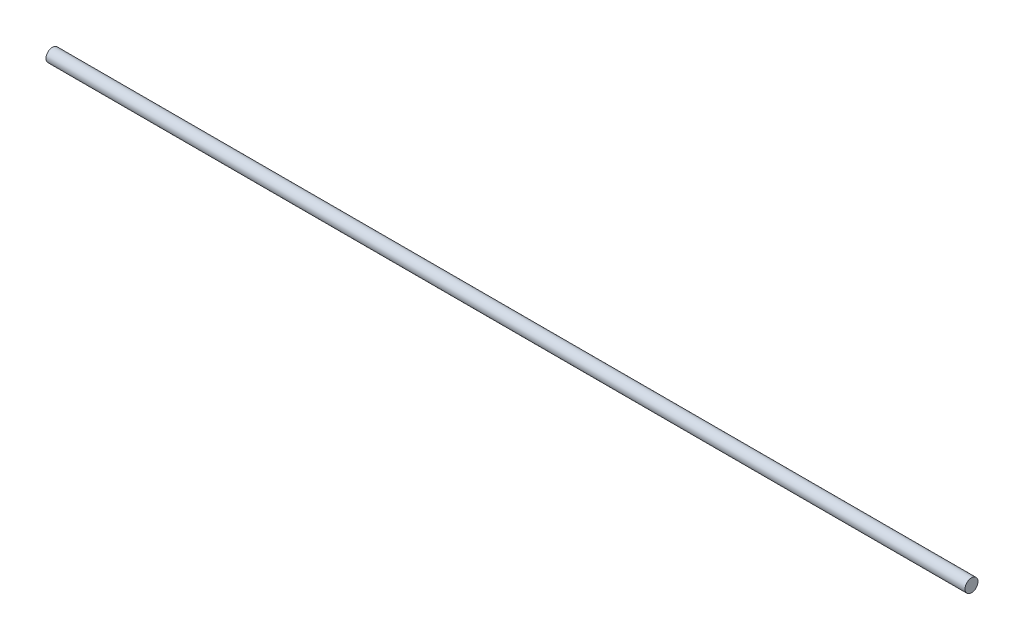
ISO-10303-21;
HEADER;
FILE_DESCRIPTION(('STEP AP214'),'2;1');
FILE_NAME('part.step','',(''),(''),'','','');
FILE_SCHEMA(('AUTOMOTIVE_DESIGN { 1 0 10303 214 1 1 1 1 }'));
ENDSEC;
DATA;
#1=APPLICATION_CONTEXT('core data for automotive mechanical design processes');
#2=APPLICATION_PROTOCOL_DEFINITION('international standard','automotive_design',2000,#1);
#3=PRODUCT_CONTEXT('',#1,'mechanical');
#4=PRODUCT('Part','Part','',(#3));
#5=PRODUCT_RELATED_PRODUCT_CATEGORY('part','',(#4));
#6=PRODUCT_DEFINITION_FORMATION('','',#4);
#7=PRODUCT_DEFINITION_CONTEXT('part definition',#1,'design');
#8=PRODUCT_DEFINITION('design','',#6,#7);
#9=PRODUCT_DEFINITION_SHAPE('','',#8);
#10=(LENGTH_UNIT() NAMED_UNIT(*) SI_UNIT(.MILLI.,.METRE.));
#11=(NAMED_UNIT(*) PLANE_ANGLE_UNIT() SI_UNIT($,.RADIAN.));
#12=(NAMED_UNIT(*) SI_UNIT($,.STERADIAN.) SOLID_ANGLE_UNIT());
#13=UNCERTAINTY_MEASURE_WITH_UNIT(LENGTH_MEASURE(1.E-05),#10,'distance_accuracy_value','');
#14=(GEOMETRIC_REPRESENTATION_CONTEXT(3) GLOBAL_UNCERTAINTY_ASSIGNED_CONTEXT((#13)) GLOBAL_UNIT_ASSIGNED_CONTEXT((#10,
#11,#12)) REPRESENTATION_CONTEXT('',''));
#15=CARTESIAN_POINT('',(0.,0.,0.));
#16=DIRECTION('',(0.,0.,1.));
#17=DIRECTION('',(1.,0.,0.));
#18=AXIS2_PLACEMENT_3D('',#15,#16,#17);
#19=CARTESIAN_POINT('',(897.93726372945,0.,0.));
#20=DIRECTION('',(-1.,0.,0.));
#21=DIRECTION('',(0.,0.,1.));
#22=AXIS2_PLACEMENT_3D('',#19,#20,#21);
#23=CYLINDRICAL_SURFACE('',#22,6.35);
#24=CARTESIAN_POINT('',(897.93726372945,0.,0.));
#25=DIRECTION('',(1.,0.,0.));
#26=DIRECTION('',(0.,0.,-1.));
#27=AXIS2_PLACEMENT_3D('',#24,#25,#26);
#28=CIRCLE('',#27,6.35);
#29=CARTESIAN_POINT('',(897.93726372945,0.,-6.35));
#30=VERTEX_POINT('',#29);
#31=EDGE_CURVE('E10',#30,#30,#28,.T.);
#32=ORIENTED_EDGE('',*,*,#31,.F.);
#33=EDGE_LOOP('',(#32));
#34=FACE_BOUND('',#33,.T.);
#35=CARTESIAN_POINT('',(0.,0.,0.));
#36=DIRECTION('',(1.,0.,0.));
#37=DIRECTION('',(0.,0.,-1.));
#38=AXIS2_PLACEMENT_3D('',#35,#36,#37);
#39=CIRCLE('',#38,6.35);
#40=CARTESIAN_POINT('',(0.,0.,-6.35));
#41=VERTEX_POINT('',#40);
#42=EDGE_CURVE('E46',#41,#41,#39,.T.);
#43=ORIENTED_EDGE('',*,*,#42,.T.);
#44=EDGE_LOOP('',(#43));
#45=FACE_BOUND('',#44,.T.);
#46=ADVANCED_FACE('F43',(#34,#45),#23,.T.);
#47=CARTESIAN_POINT('',(897.93726372945,0.,0.));
#48=DIRECTION('',(1.,0.,0.));
#49=DIRECTION('',(0.,0.,-1.));
#50=AXIS2_PLACEMENT_3D('',#47,#48,#49);
#51=PLANE('',#50);
#52=ORIENTED_EDGE('',*,*,#31,.T.);
#53=EDGE_LOOP('',(#52));
#54=FACE_BOUND('',#53,.T.);
#55=ADVANCED_FACE('F60',(#54),#51,.T.);
#56=CARTESIAN_POINT('',(0.,0.,0.));
#57=DIRECTION('',(1.,0.,0.));
#58=DIRECTION('',(0.,0.,-1.));
#59=AXIS2_PLACEMENT_3D('',#56,#57,#58);
#60=PLANE('',#59);
#61=ORIENTED_EDGE('',*,*,#42,.F.);
#62=EDGE_LOOP('',(#61));
#63=FACE_BOUND('',#62,.T.);
#64=ADVANCED_FACE('F58',(#63),#60,.F.);
#65=CLOSED_SHELL('',(#46,#55,#64));
#66=MANIFOLD_SOLID_BREP('B2',#65);
#67=ADVANCED_BREP_SHAPE_REPRESENTATION('',(#18,#66),#14);
#68=SHAPE_DEFINITION_REPRESENTATION(#9,#67);
ENDSEC;
END-ISO-10303-21;
